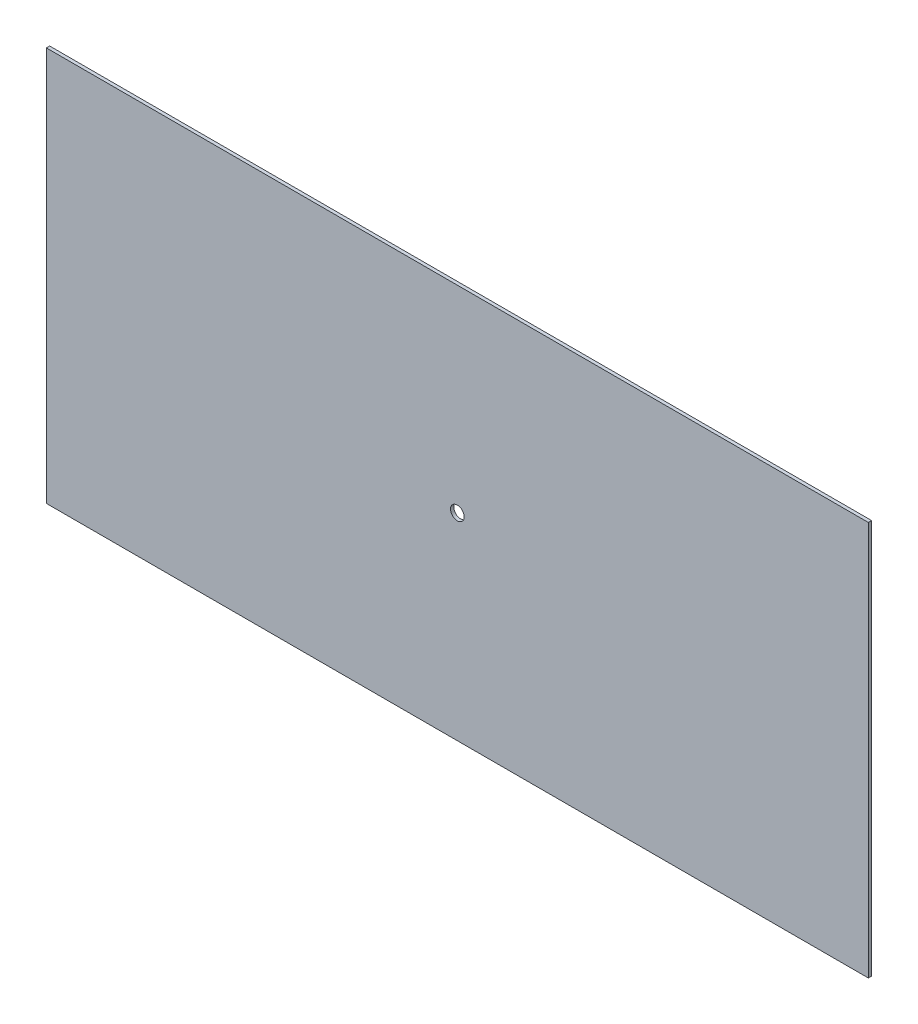
ISO-10303-21;
HEADER;
FILE_DESCRIPTION(('STEP AP214'),'2;1');
FILE_NAME('part.step','',(''),(''),'','','');
FILE_SCHEMA(('AUTOMOTIVE_DESIGN { 1 0 10303 214 1 1 1 1 }'));
ENDSEC;
DATA;
#1=APPLICATION_CONTEXT('core data for automotive mechanical design processes');
#2=APPLICATION_PROTOCOL_DEFINITION('international standard','automotive_design',2000,#1);
#3=PRODUCT_CONTEXT('',#1,'mechanical');
#4=PRODUCT('Part','Part','',(#3));
#5=PRODUCT_RELATED_PRODUCT_CATEGORY('part','',(#4));
#6=PRODUCT_DEFINITION_FORMATION('','',#4);
#7=PRODUCT_DEFINITION_CONTEXT('part definition',#1,'design');
#8=PRODUCT_DEFINITION('design','',#6,#7);
#9=PRODUCT_DEFINITION_SHAPE('','',#8);
#10=(LENGTH_UNIT() NAMED_UNIT(*) SI_UNIT(.MILLI.,.METRE.));
#11=(NAMED_UNIT(*) PLANE_ANGLE_UNIT() SI_UNIT($,.RADIAN.));
#12=(NAMED_UNIT(*) SI_UNIT($,.STERADIAN.) SOLID_ANGLE_UNIT());
#13=UNCERTAINTY_MEASURE_WITH_UNIT(LENGTH_MEASURE(1.E-05),#10,'distance_accuracy_value','');
#14=(GEOMETRIC_REPRESENTATION_CONTEXT(3) GLOBAL_UNCERTAINTY_ASSIGNED_CONTEXT((#13)) GLOBAL_UNIT_ASSIGNED_CONTEXT((#10,
#11,#12)) REPRESENTATION_CONTEXT('',''));
#15=CARTESIAN_POINT('',(0.,0.,0.));
#16=DIRECTION('',(0.,0.,1.));
#17=DIRECTION('',(1.,0.,0.));
#18=AXIS2_PLACEMENT_3D('',#15,#16,#17);
#19=CARTESIAN_POINT('',(-125.,-60.,151.));
#20=DIRECTION('',(1.,0.,0.));
#21=DIRECTION('',(0.,1.,0.));
#22=AXIS2_PLACEMENT_3D('',#19,#20,#21);
#23=PLANE('',#22);
#24=DIRECTION('',(0.,-1.,0.));
#25=VECTOR('',#24,1.);
#26=CARTESIAN_POINT('',(-125.,-60.,150.));
#27=LINE('',#26,#25);
#28=CARTESIAN_POINT('',(-125.,60.,150.));
#29=VERTEX_POINT('',#28);
#30=CARTESIAN_POINT('',(-125.,-60.,150.));
#31=VERTEX_POINT('',#30);
#32=EDGE_CURVE('E114',#29,#31,#27,.T.);
#33=ORIENTED_EDGE('',*,*,#32,.T.);
#34=DIRECTION('',(0.,0.,-1.));
#35=VECTOR('',#34,1.);
#36=CARTESIAN_POINT('',(-125.,-60.,151.));
#37=LINE('',#36,#35);
#38=CARTESIAN_POINT('',(-125.,-60.,151.));
#39=VERTEX_POINT('',#38);
#40=EDGE_CURVE('E11',#39,#31,#37,.T.);
#41=ORIENTED_EDGE('',*,*,#40,.F.);
#42=DIRECTION('',(0.,-1.,0.));
#43=VECTOR('',#42,1.);
#44=CARTESIAN_POINT('',(-125.,-60.,151.));
#45=LINE('',#44,#43);
#46=CARTESIAN_POINT('',(-125.,60.,151.));
#47=VERTEX_POINT('',#46);
#48=EDGE_CURVE('E97',#47,#39,#45,.T.);
#49=ORIENTED_EDGE('',*,*,#48,.F.);
#50=DIRECTION('',(0.,0.,-1.));
#51=VECTOR('',#50,1.);
#52=CARTESIAN_POINT('',(-125.,60.,151.));
#53=LINE('',#52,#51);
#54=EDGE_CURVE('E110',#47,#29,#53,.T.);
#55=ORIENTED_EDGE('',*,*,#54,.T.);
#56=EDGE_LOOP('',(#33,#41,#49,#55));
#57=FACE_BOUND('',#56,.T.);
#58=ADVANCED_FACE('F44',(#57),#23,.F.);
#59=CARTESIAN_POINT('',(-125.,-60.,151.));
#60=DIRECTION('',(0.,1.,0.));
#61=DIRECTION('',(0.,0.,1.));
#62=AXIS2_PLACEMENT_3D('',#59,#60,#61);
#63=PLANE('',#62);
#64=DIRECTION('',(1.,0.,0.));
#65=VECTOR('',#64,1.);
#66=CARTESIAN_POINT('',(-125.,-60.,150.));
#67=LINE('',#66,#65);
#68=CARTESIAN_POINT('',(125.,-60.,150.));
#69=VERTEX_POINT('',#68);
#70=EDGE_CURVE('E102',#31,#69,#67,.T.);
#71=ORIENTED_EDGE('',*,*,#70,.T.);
#72=DIRECTION('',(0.,0.,-1.));
#73=VECTOR('',#72,1.);
#74=CARTESIAN_POINT('',(125.,-60.,151.));
#75=LINE('',#74,#73);
#76=CARTESIAN_POINT('',(125.,-60.,151.));
#77=VERTEX_POINT('',#76);
#78=EDGE_CURVE('E54',#77,#69,#75,.T.);
#79=ORIENTED_EDGE('',*,*,#78,.F.);
#80=DIRECTION('',(1.,0.,0.));
#81=VECTOR('',#80,1.);
#82=CARTESIAN_POINT('',(-125.,-60.,151.));
#83=LINE('',#82,#81);
#84=EDGE_CURVE('E92',#39,#77,#83,.T.);
#85=ORIENTED_EDGE('',*,*,#84,.F.);
#86=ORIENTED_EDGE('',*,*,#40,.T.);
#87=EDGE_LOOP('',(#71,#79,#85,#86));
#88=FACE_BOUND('',#87,.T.);
#89=ADVANCED_FACE('F101',(#88),#63,.F.);
#90=CARTESIAN_POINT('',(125.,-60.,151.));
#91=DIRECTION('',(-1.,0.,0.));
#92=DIRECTION('',(0.,0.,1.));
#93=AXIS2_PLACEMENT_3D('',#90,#91,#92);
#94=PLANE('',#93);
#95=DIRECTION('',(0.,1.,0.));
#96=VECTOR('',#95,1.);
#97=CARTESIAN_POINT('',(125.,-60.,150.));
#98=LINE('',#97,#96);
#99=CARTESIAN_POINT('',(125.,60.,150.));
#100=VERTEX_POINT('',#99);
#101=EDGE_CURVE('E79',#69,#100,#98,.T.);
#102=ORIENTED_EDGE('',*,*,#101,.T.);
#103=DIRECTION('',(0.,0.,-1.));
#104=VECTOR('',#103,1.);
#105=CARTESIAN_POINT('',(125.,60.,151.));
#106=LINE('',#105,#104);
#107=CARTESIAN_POINT('',(125.,60.,151.));
#108=VERTEX_POINT('',#107);
#109=EDGE_CURVE('E104',#108,#100,#106,.T.);
#110=ORIENTED_EDGE('',*,*,#109,.F.);
#111=DIRECTION('',(0.,1.,0.));
#112=VECTOR('',#111,1.);
#113=CARTESIAN_POINT('',(125.,-60.,151.));
#114=LINE('',#113,#112);
#115=EDGE_CURVE('E95',#77,#108,#114,.T.);
#116=ORIENTED_EDGE('',*,*,#115,.F.);
#117=ORIENTED_EDGE('',*,*,#78,.T.);
#118=EDGE_LOOP('',(#102,#110,#116,#117));
#119=FACE_BOUND('',#118,.T.);
#120=ADVANCED_FACE('F106',(#119),#94,.F.);
#121=CARTESIAN_POINT('',(-125.,60.,151.));
#122=DIRECTION('',(0.,-1.,0.));
#123=DIRECTION('',(1.,0.,0.));
#124=AXIS2_PLACEMENT_3D('',#121,#122,#123);
#125=PLANE('',#124);
#126=DIRECTION('',(-1.,0.,0.));
#127=VECTOR('',#126,1.);
#128=CARTESIAN_POINT('',(-125.,60.,150.));
#129=LINE('',#128,#127);
#130=EDGE_CURVE('E85',#100,#29,#129,.T.);
#131=ORIENTED_EDGE('',*,*,#130,.T.);
#132=ORIENTED_EDGE('',*,*,#54,.F.);
#133=DIRECTION('',(-1.,0.,0.));
#134=VECTOR('',#133,1.);
#135=CARTESIAN_POINT('',(-125.,60.,151.));
#136=LINE('',#135,#134);
#137=EDGE_CURVE('E62',#108,#47,#136,.T.);
#138=ORIENTED_EDGE('',*,*,#137,.F.);
#139=ORIENTED_EDGE('',*,*,#109,.T.);
#140=EDGE_LOOP('',(#131,#132,#138,#139));
#141=FACE_BOUND('',#140,.T.);
#142=ADVANCED_FACE('F127',(#141),#125,.F.);
#143=CARTESIAN_POINT('',(0.,0.,151.));
#144=DIRECTION('',(0.,0.,-1.));
#145=DIRECTION('',(-1.,0.,0.));
#146=AXIS2_PLACEMENT_3D('',#143,#144,#145);
#147=PLANE('',#146);
#148=CARTESIAN_POINT('',(0.,0.,151.));
#149=DIRECTION('',(0.,0.,1.));
#150=DIRECTION('',(1.,0.,0.));
#151=AXIS2_PLACEMENT_3D('',#148,#149,#150);
#152=CIRCLE('',#151,2.075);
#153=CARTESIAN_POINT('',(2.075,0.,151.));
#154=VERTEX_POINT('',#153);
#155=EDGE_CURVE('E134',#154,#154,#152,.T.);
#156=ORIENTED_EDGE('',*,*,#155,.F.);
#157=EDGE_LOOP('',(#156));
#158=FACE_BOUND('',#157,.T.);
#159=ORIENTED_EDGE('',*,*,#48,.T.);
#160=ORIENTED_EDGE('',*,*,#84,.T.);
#161=ORIENTED_EDGE('',*,*,#115,.T.);
#162=ORIENTED_EDGE('',*,*,#137,.T.);
#163=EDGE_LOOP('',(#159,#160,#161,#162));
#164=FACE_BOUND('',#163,.T.);
#165=ADVANCED_FACE('F93',(#158,#164),#147,.F.);
#166=CARTESIAN_POINT('',(0.,0.,150.));
#167=DIRECTION('',(0.,0.,-1.));
#168=DIRECTION('',(-1.,0.,0.));
#169=AXIS2_PLACEMENT_3D('',#166,#167,#168);
#170=PLANE('',#169);
#171=CARTESIAN_POINT('',(0.,0.,150.));
#172=DIRECTION('',(0.,0.,-1.));
#173=DIRECTION('',(-1.,0.,0.));
#174=AXIS2_PLACEMENT_3D('',#171,#172,#173);
#175=CIRCLE('',#174,2.075);
#176=CARTESIAN_POINT('',(-2.075,0.,150.));
#177=VERTEX_POINT('',#176);
#178=EDGE_CURVE('E47',#177,#177,#175,.T.);
#179=ORIENTED_EDGE('',*,*,#178,.F.);
#180=EDGE_LOOP('',(#179));
#181=FACE_BOUND('',#180,.T.);
#182=ORIENTED_EDGE('',*,*,#32,.F.);
#183=ORIENTED_EDGE('',*,*,#130,.F.);
#184=ORIENTED_EDGE('',*,*,#101,.F.);
#185=ORIENTED_EDGE('',*,*,#70,.F.);
#186=EDGE_LOOP('',(#182,#183,#184,#185));
#187=FACE_BOUND('',#186,.T.);
#188=ADVANCED_FACE('F130',(#181,#187),#170,.T.);
#189=CARTESIAN_POINT('',(0.,0.,141.));
#190=DIRECTION('',(0.,0.,1.));
#191=DIRECTION('',(1.,0.,0.));
#192=AXIS2_PLACEMENT_3D('',#189,#190,#191);
#193=CYLINDRICAL_SURFACE('',#192,2.075);
#194=ORIENTED_EDGE('',*,*,#178,.T.);
#195=EDGE_LOOP('',(#194));
#196=FACE_BOUND('',#195,.T.);
#197=ORIENTED_EDGE('',*,*,#155,.T.);
#198=EDGE_LOOP('',(#197));
#199=FACE_BOUND('',#198,.T.);
#200=ADVANCED_FACE('F143',(#196,#199),#193,.F.);
#201=CLOSED_SHELL('',(#58,#89,#120,#142,#165,#188,#200));
#202=MANIFOLD_SOLID_BREP('B2',#201);
#203=ADVANCED_BREP_SHAPE_REPRESENTATION('',(#18,#202),#14);
#204=SHAPE_DEFINITION_REPRESENTATION(#9,#203);
ENDSEC;
END-ISO-10303-21;
